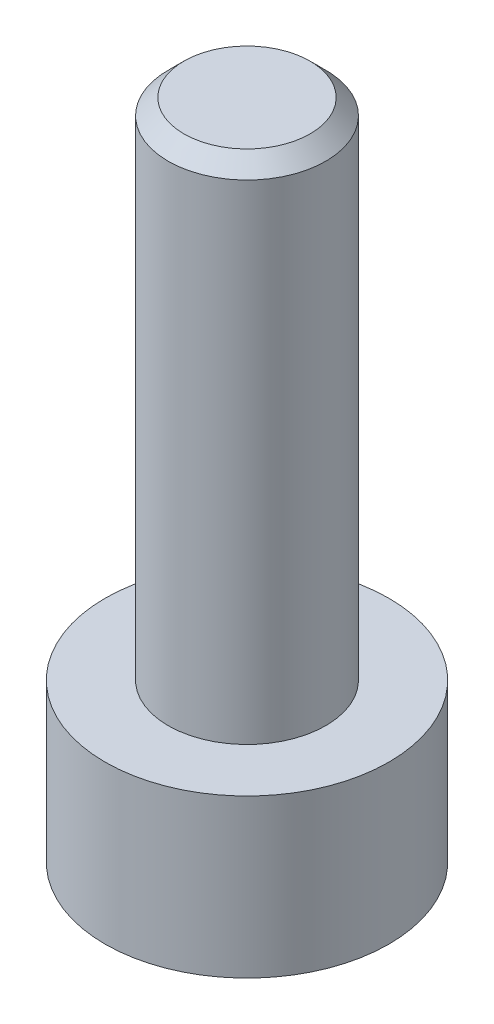
ISO-10303-21;
HEADER;
FILE_DESCRIPTION(('STEP AP214'),'2;1');
FILE_NAME('part.step','',(''),(''),'','','');
FILE_SCHEMA(('AUTOMOTIVE_DESIGN { 1 0 10303 214 1 1 1 1 }'));
ENDSEC;
DATA;
#1=APPLICATION_CONTEXT('core data for automotive mechanical design processes');
#2=APPLICATION_PROTOCOL_DEFINITION('international standard','automotive_design',2000,#1);
#3=PRODUCT_CONTEXT('',#1,'mechanical');
#4=PRODUCT('Part','Part','',(#3));
#5=PRODUCT_RELATED_PRODUCT_CATEGORY('part','',(#4));
#6=PRODUCT_DEFINITION_FORMATION('','',#4);
#7=PRODUCT_DEFINITION_CONTEXT('part definition',#1,'design');
#8=PRODUCT_DEFINITION('design','',#6,#7);
#9=PRODUCT_DEFINITION_SHAPE('','',#8);
#10=(LENGTH_UNIT() NAMED_UNIT(*) SI_UNIT(.MILLI.,.METRE.));
#11=(NAMED_UNIT(*) PLANE_ANGLE_UNIT() SI_UNIT($,.RADIAN.));
#12=(NAMED_UNIT(*) SI_UNIT($,.STERADIAN.) SOLID_ANGLE_UNIT());
#13=UNCERTAINTY_MEASURE_WITH_UNIT(LENGTH_MEASURE(1.E-05),#10,'distance_accuracy_value','');
#14=(GEOMETRIC_REPRESENTATION_CONTEXT(3) GLOBAL_UNCERTAINTY_ASSIGNED_CONTEXT((#13)) GLOBAL_UNIT_ASSIGNED_CONTEXT((#10,
#11,#12)) REPRESENTATION_CONTEXT('',''));
#15=CARTESIAN_POINT('',(0.,0.,0.));
#16=DIRECTION('',(0.,0.,1.));
#17=DIRECTION('',(1.,0.,0.));
#18=AXIS2_PLACEMENT_3D('',#15,#16,#17);
#19=CARTESIAN_POINT('',(0.,2.5,0.));
#20=DIRECTION('',(0.,-1.,0.));
#21=DIRECTION('',(0.,0.,-1.));
#22=AXIS2_PLACEMENT_3D('',#19,#20,#21);
#23=CYLINDRICAL_SURFACE('',#22,2.25);
#24=CARTESIAN_POINT('',(0.,2.5,0.));
#25=DIRECTION('',(0.,1.,0.));
#26=DIRECTION('',(0.,0.,1.));
#27=AXIS2_PLACEMENT_3D('',#24,#25,#26);
#28=CIRCLE('',#27,2.25);
#29=CARTESIAN_POINT('',(0.,2.5,2.25));
#30=VERTEX_POINT('',#29);
#31=EDGE_CURVE('E161',#30,#30,#28,.T.);
#32=ORIENTED_EDGE('',*,*,#31,.F.);
#33=EDGE_LOOP('',(#32));
#34=FACE_BOUND('',#33,.T.);
#35=CARTESIAN_POINT('',(0.,0.,0.));
#36=DIRECTION('',(0.,1.,0.));
#37=DIRECTION('',(0.,0.,1.));
#38=AXIS2_PLACEMENT_3D('',#35,#36,#37);
#39=CIRCLE('',#38,2.25);
#40=CARTESIAN_POINT('',(0.,0.,2.25));
#41=VERTEX_POINT('',#40);
#42=EDGE_CURVE('E152',#41,#41,#39,.T.);
#43=ORIENTED_EDGE('',*,*,#42,.T.);
#44=EDGE_LOOP('',(#43));
#45=FACE_BOUND('',#44,.T.);
#46=ADVANCED_FACE('F49',(#34,#45),#23,.T.);
#47=CARTESIAN_POINT('',(0.,2.5,0.));
#48=DIRECTION('',(0.,1.,0.));
#49=DIRECTION('',(0.,0.,1.));
#50=AXIS2_PLACEMENT_3D('',#47,#48,#49);
#51=PLANE('',#50);
#52=CARTESIAN_POINT('',(0.,2.5,0.));
#53=DIRECTION('',(0.,1.,0.));
#54=DIRECTION('',(0.,0.,1.));
#55=AXIS2_PLACEMENT_3D('',#52,#53,#54);
#56=CIRCLE('',#55,1.25);
#57=CARTESIAN_POINT('',(0.,2.5,1.25));
#58=VERTEX_POINT('',#57);
#59=EDGE_CURVE('E158',#58,#58,#56,.T.);
#60=ORIENTED_EDGE('',*,*,#59,.F.);
#61=EDGE_LOOP('',(#60));
#62=FACE_BOUND('',#61,.T.);
#63=ORIENTED_EDGE('',*,*,#31,.T.);
#64=EDGE_LOOP('',(#63));
#65=FACE_BOUND('',#64,.T.);
#66=ADVANCED_FACE('F180',(#62,#65),#51,.T.);
#67=CARTESIAN_POINT('',(0.,0.,0.));
#68=DIRECTION('',(0.,1.,0.));
#69=DIRECTION('',(0.,0.,1.));
#70=AXIS2_PLACEMENT_3D('',#67,#68,#69);
#71=PLANE('',#70);
#72=DIRECTION('',(0.866025403784438,0.,0.5));
#73=VECTOR('',#72,1.);
#74=CARTESIAN_POINT('',(0.,0.,-1.15470053837925));
#75=LINE('',#74,#73);
#76=CARTESIAN_POINT('',(0.,0.,-1.15470053837925));
#77=VERTEX_POINT('',#76);
#78=CARTESIAN_POINT('',(1.,0.,-0.577350269189626));
#79=VERTEX_POINT('',#78);
#80=EDGE_CURVE('E139',#77,#79,#75,.T.);
#81=ORIENTED_EDGE('',*,*,#80,.F.);
#82=DIRECTION('',(0.866025403784438,0.,-0.5));
#83=VECTOR('',#82,1.);
#84=CARTESIAN_POINT('',(-1.,0.,-0.577350269189625));
#85=LINE('',#84,#83);
#86=CARTESIAN_POINT('',(-1.,0.,-0.577350269189625));
#87=VERTEX_POINT('',#86);
#88=EDGE_CURVE('E65',#87,#77,#85,.T.);
#89=ORIENTED_EDGE('',*,*,#88,.F.);
#90=DIRECTION('',(0.,0.,-1.));
#91=VECTOR('',#90,1.);
#92=CARTESIAN_POINT('',(-1.,0.,0.577350269189626));
#93=LINE('',#92,#91);
#94=CARTESIAN_POINT('',(-1.,0.,0.577350269189626));
#95=VERTEX_POINT('',#94);
#96=EDGE_CURVE('E148',#95,#87,#93,.T.);
#97=ORIENTED_EDGE('',*,*,#96,.F.);
#98=DIRECTION('',(-0.866025403784439,0.,-0.5));
#99=VECTOR('',#98,1.);
#100=CARTESIAN_POINT('',(0.,0.,1.15470053837925));
#101=LINE('',#100,#99);
#102=CARTESIAN_POINT('',(0.,0.,1.15470053837925));
#103=VERTEX_POINT('',#102);
#104=EDGE_CURVE('E146',#103,#95,#101,.T.);
#105=ORIENTED_EDGE('',*,*,#104,.F.);
#106=DIRECTION('',(-0.866025403784439,0.,0.5));
#107=VECTOR('',#106,1.);
#108=CARTESIAN_POINT('',(1.,0.,0.577350269189627));
#109=LINE('',#108,#107);
#110=CARTESIAN_POINT('',(1.,0.,0.577350269189627));
#111=VERTEX_POINT('',#110);
#112=EDGE_CURVE('E113',#111,#103,#109,.T.);
#113=ORIENTED_EDGE('',*,*,#112,.F.);
#114=DIRECTION('',(0.,0.,1.));
#115=VECTOR('',#114,1.);
#116=CARTESIAN_POINT('',(1.,0.,-0.577350269189626));
#117=LINE('',#116,#115);
#118=EDGE_CURVE('E142',#79,#111,#117,.T.);
#119=ORIENTED_EDGE('',*,*,#118,.F.);
#120=EDGE_LOOP('',(#81,#89,#97,#105,#113,#119));
#121=FACE_BOUND('',#120,.T.);
#122=ORIENTED_EDGE('',*,*,#42,.F.);
#123=EDGE_LOOP('',(#122));
#124=FACE_BOUND('',#123,.T.);
#125=ADVANCED_FACE('F185',(#121,#124),#71,.F.);
#126=CARTESIAN_POINT('',(0.,10.5,0.));
#127=DIRECTION('',(0.,-1.,0.));
#128=DIRECTION('',(0.,0.,-1.));
#129=AXIS2_PLACEMENT_3D('',#126,#127,#128);
#130=CYLINDRICAL_SURFACE('',#129,1.25);
#131=CARTESIAN_POINT('',(0.,10.25,0.));
#132=DIRECTION('',(0.,1.,0.));
#133=DIRECTION('',(0.,0.,1.));
#134=AXIS2_PLACEMENT_3D('',#131,#132,#133);
#135=CIRCLE('',#134,1.25);
#136=CARTESIAN_POINT('',(0.,10.25,1.25));
#137=VERTEX_POINT('',#136);
#138=EDGE_CURVE('E11',#137,#137,#135,.F.);
#139=ORIENTED_EDGE('',*,*,#138,.T.);
#140=EDGE_LOOP('',(#139));
#141=FACE_BOUND('',#140,.T.);
#142=ORIENTED_EDGE('',*,*,#59,.T.);
#143=EDGE_LOOP('',(#142));
#144=FACE_BOUND('',#143,.T.);
#145=ADVANCED_FACE('F192',(#141,#144),#130,.T.);
#146=CARTESIAN_POINT('',(0.,10.5,0.));
#147=DIRECTION('',(0.,1.,0.));
#148=DIRECTION('',(0.,0.,1.));
#149=AXIS2_PLACEMENT_3D('',#146,#147,#148);
#150=PLANE('',#149);
#151=CARTESIAN_POINT('',(0.,10.5,0.));
#152=DIRECTION('',(0.,1.,0.));
#153=DIRECTION('',(0.,0.,1.));
#154=AXIS2_PLACEMENT_3D('',#151,#152,#153);
#155=CIRCLE('',#154,0.999999999999999);
#156=CARTESIAN_POINT('',(0.,10.5,0.999999999999999));
#157=VERTEX_POINT('',#156);
#158=EDGE_CURVE('E58',#157,#157,#155,.T.);
#159=ORIENTED_EDGE('',*,*,#158,.T.);
#160=EDGE_LOOP('',(#159));
#161=FACE_BOUND('',#160,.T.);
#162=ADVANCED_FACE('F168',(#161),#150,.T.);
#163=CARTESIAN_POINT('',(-1.,1.1,-0.577350269189625));
#164=DIRECTION('',(-0.5,0.,-0.866025403784439));
#165=DIRECTION('',(-0.866025403784439,0.,0.5));
#166=AXIS2_PLACEMENT_3D('',#163,#164,#165);
#167=PLANE('',#166);
#168=ORIENTED_EDGE('',*,*,#88,.T.);
#169=DIRECTION('',(0.,-1.,0.));
#170=VECTOR('',#169,1.);
#171=CARTESIAN_POINT('',(0.,1.1,-1.15470053837925));
#172=LINE('',#171,#170);
#173=CARTESIAN_POINT('',(0.,1.1,-1.15470053837925));
#174=VERTEX_POINT('',#173);
#175=EDGE_CURVE('E95',#174,#77,#172,.T.);
#176=ORIENTED_EDGE('',*,*,#175,.F.);
#177=DIRECTION('',(0.866025403784438,0.,-0.5));
#178=VECTOR('',#177,1.);
#179=CARTESIAN_POINT('',(-1.,1.1,-0.577350269189625));
#180=LINE('',#179,#178);
#181=CARTESIAN_POINT('',(-1.,1.1,-0.577350269189625));
#182=VERTEX_POINT('',#181);
#183=EDGE_CURVE('E150',#182,#174,#180,.T.);
#184=ORIENTED_EDGE('',*,*,#183,.F.);
#185=DIRECTION('',(0.,-1.,0.));
#186=VECTOR('',#185,1.);
#187=CARTESIAN_POINT('',(-1.,1.1,-0.577350269189625));
#188=LINE('',#187,#186);
#189=EDGE_CURVE('E73',#182,#87,#188,.T.);
#190=ORIENTED_EDGE('',*,*,#189,.T.);
#191=EDGE_LOOP('',(#168,#176,#184,#190));
#192=FACE_BOUND('',#191,.T.);
#193=ADVANCED_FACE('F200',(#192),#167,.F.);
#194=CARTESIAN_POINT('',(-1.,1.1,0.577350269189626));
#195=DIRECTION('',(-1.,0.,0.));
#196=DIRECTION('',(0.,0.,1.));
#197=AXIS2_PLACEMENT_3D('',#194,#195,#196);
#198=PLANE('',#197);
#199=ORIENTED_EDGE('',*,*,#96,.T.);
#200=ORIENTED_EDGE('',*,*,#189,.F.);
#201=DIRECTION('',(0.,0.,-1.));
#202=VECTOR('',#201,1.);
#203=CARTESIAN_POINT('',(-1.,1.1,0.577350269189626));
#204=LINE('',#203,#202);
#205=CARTESIAN_POINT('',(-1.,1.1,0.577350269189626));
#206=VERTEX_POINT('',#205);
#207=EDGE_CURVE('E125',#206,#182,#204,.T.);
#208=ORIENTED_EDGE('',*,*,#207,.F.);
#209=DIRECTION('',(0.,-1.,0.));
#210=VECTOR('',#209,1.);
#211=CARTESIAN_POINT('',(-1.,1.1,0.577350269189626));
#212=LINE('',#211,#210);
#213=EDGE_CURVE('E117',#206,#95,#212,.T.);
#214=ORIENTED_EDGE('',*,*,#213,.T.);
#215=EDGE_LOOP('',(#199,#200,#208,#214));
#216=FACE_BOUND('',#215,.T.);
#217=ADVANCED_FACE('F203',(#216),#198,.F.);
#218=CARTESIAN_POINT('',(0.,1.1,1.15470053837925));
#219=DIRECTION('',(-0.5,0.,0.866025403784438));
#220=DIRECTION('',(0.866025403784439,0.,0.5));
#221=AXIS2_PLACEMENT_3D('',#218,#219,#220);
#222=PLANE('',#221);
#223=ORIENTED_EDGE('',*,*,#104,.T.);
#224=ORIENTED_EDGE('',*,*,#213,.F.);
#225=DIRECTION('',(-0.866025403784439,0.,-0.5));
#226=VECTOR('',#225,1.);
#227=CARTESIAN_POINT('',(0.,1.1,1.15470053837925));
#228=LINE('',#227,#226);
#229=CARTESIAN_POINT('',(0.,1.1,1.15470053837925));
#230=VERTEX_POINT('',#229);
#231=EDGE_CURVE('E121',#230,#206,#228,.T.);
#232=ORIENTED_EDGE('',*,*,#231,.F.);
#233=DIRECTION('',(0.,-1.,0.));
#234=VECTOR('',#233,1.);
#235=CARTESIAN_POINT('',(0.,1.1,1.15470053837925));
#236=LINE('',#235,#234);
#237=EDGE_CURVE('E106',#230,#103,#236,.T.);
#238=ORIENTED_EDGE('',*,*,#237,.T.);
#239=EDGE_LOOP('',(#223,#224,#232,#238));
#240=FACE_BOUND('',#239,.T.);
#241=ADVANCED_FACE('F122',(#240),#222,.F.);
#242=CARTESIAN_POINT('',(1.,1.1,0.577350269189627));
#243=DIRECTION('',(0.5,0.,0.866025403784439));
#244=DIRECTION('',(0.866025403784439,0.,-0.5));
#245=AXIS2_PLACEMENT_3D('',#242,#243,#244);
#246=PLANE('',#245);
#247=ORIENTED_EDGE('',*,*,#112,.T.);
#248=ORIENTED_EDGE('',*,*,#237,.F.);
#249=DIRECTION('',(-0.866025403784439,0.,0.5));
#250=VECTOR('',#249,1.);
#251=CARTESIAN_POINT('',(1.,1.1,0.577350269189627));
#252=LINE('',#251,#250);
#253=CARTESIAN_POINT('',(1.,1.1,0.577350269189627));
#254=VERTEX_POINT('',#253);
#255=EDGE_CURVE('E110',#254,#230,#252,.T.);
#256=ORIENTED_EDGE('',*,*,#255,.F.);
#257=DIRECTION('',(0.,-1.,0.));
#258=VECTOR('',#257,1.);
#259=CARTESIAN_POINT('',(1.,1.1,0.577350269189627));
#260=LINE('',#259,#258);
#261=EDGE_CURVE('E118',#254,#111,#260,.T.);
#262=ORIENTED_EDGE('',*,*,#261,.T.);
#263=EDGE_LOOP('',(#247,#248,#256,#262));
#264=FACE_BOUND('',#263,.T.);
#265=ADVANCED_FACE('F108',(#264),#246,.F.);
#266=CARTESIAN_POINT('',(1.,1.1,-0.577350269189626));
#267=DIRECTION('',(1.,0.,0.));
#268=DIRECTION('',(0.,0.,-1.));
#269=AXIS2_PLACEMENT_3D('',#266,#267,#268);
#270=PLANE('',#269);
#271=ORIENTED_EDGE('',*,*,#118,.T.);
#272=ORIENTED_EDGE('',*,*,#261,.F.);
#273=DIRECTION('',(0.,0.,1.));
#274=VECTOR('',#273,1.);
#275=CARTESIAN_POINT('',(1.,1.1,-0.577350269189626));
#276=LINE('',#275,#274);
#277=CARTESIAN_POINT('',(1.,1.1,-0.577350269189626));
#278=VERTEX_POINT('',#277);
#279=EDGE_CURVE('E131',#278,#254,#276,.T.);
#280=ORIENTED_EDGE('',*,*,#279,.F.);
#281=DIRECTION('',(0.,-1.,0.));
#282=VECTOR('',#281,1.);
#283=CARTESIAN_POINT('',(1.,1.1,-0.577350269189626));
#284=LINE('',#283,#282);
#285=EDGE_CURVE('E155',#278,#79,#284,.T.);
#286=ORIENTED_EDGE('',*,*,#285,.T.);
#287=EDGE_LOOP('',(#271,#272,#280,#286));
#288=FACE_BOUND('',#287,.T.);
#289=ADVANCED_FACE('F206',(#288),#270,.F.);
#290=CARTESIAN_POINT('',(0.,1.1,-1.15470053837925));
#291=DIRECTION('',(0.5,0.,-0.866025403784438));
#292=DIRECTION('',(-0.866025403784439,0.,-0.5));
#293=AXIS2_PLACEMENT_3D('',#290,#291,#292);
#294=PLANE('',#293);
#295=ORIENTED_EDGE('',*,*,#80,.T.);
#296=ORIENTED_EDGE('',*,*,#285,.F.);
#297=DIRECTION('',(0.866025403784438,0.,0.5));
#298=VECTOR('',#297,1.);
#299=CARTESIAN_POINT('',(0.,1.1,-1.15470053837925));
#300=LINE('',#299,#298);
#301=EDGE_CURVE('E133',#174,#278,#300,.T.);
#302=ORIENTED_EDGE('',*,*,#301,.F.);
#303=ORIENTED_EDGE('',*,*,#175,.T.);
#304=EDGE_LOOP('',(#295,#296,#302,#303));
#305=FACE_BOUND('',#304,.T.);
#306=ADVANCED_FACE('F176',(#305),#294,.F.);
#307=CARTESIAN_POINT('',(0.,1.1,0.));
#308=DIRECTION('',(0.,-1.,0.));
#309=DIRECTION('',(0.,0.,-1.));
#310=AXIS2_PLACEMENT_3D('',#307,#308,#309);
#311=PLANE('',#310);
#312=ORIENTED_EDGE('',*,*,#183,.T.);
#313=ORIENTED_EDGE('',*,*,#301,.T.);
#314=ORIENTED_EDGE('',*,*,#279,.T.);
#315=ORIENTED_EDGE('',*,*,#255,.T.);
#316=ORIENTED_EDGE('',*,*,#231,.T.);
#317=ORIENTED_EDGE('',*,*,#207,.T.);
#318=EDGE_LOOP('',(#312,#313,#314,#315,#316,#317));
#319=FACE_BOUND('',#318,.T.);
#320=ADVANCED_FACE('F128',(#319),#311,.T.);
#321=CARTESIAN_POINT('',(0.,10.5,0.));
#322=DIRECTION('',(0.,-1.,0.));
#323=DIRECTION('',(0.,0.,-1.));
#324=AXIS2_PLACEMENT_3D('',#321,#322,#323);
#325=CONICAL_SURFACE('',#324,0.999999999999999,0.785398163397446);
#326=ORIENTED_EDGE('',*,*,#138,.F.);
#327=EDGE_LOOP('',(#326));
#328=FACE_BOUND('',#327,.T.);
#329=ORIENTED_EDGE('',*,*,#158,.F.);
#330=EDGE_LOOP('',(#329));
#331=FACE_BOUND('',#330,.T.);
#332=ADVANCED_FACE('F52',(#328,#331),#325,.T.);
#333=CLOSED_SHELL('',(#46,#66,#125,#145,#162,#193,#217,#241,#265,#289,#306,#320,#332));
#334=MANIFOLD_SOLID_BREP('B2',#333);
#335=ADVANCED_BREP_SHAPE_REPRESENTATION('',(#18,#334),#14);
#336=SHAPE_DEFINITION_REPRESENTATION(#9,#335);
ENDSEC;
END-ISO-10303-21;
